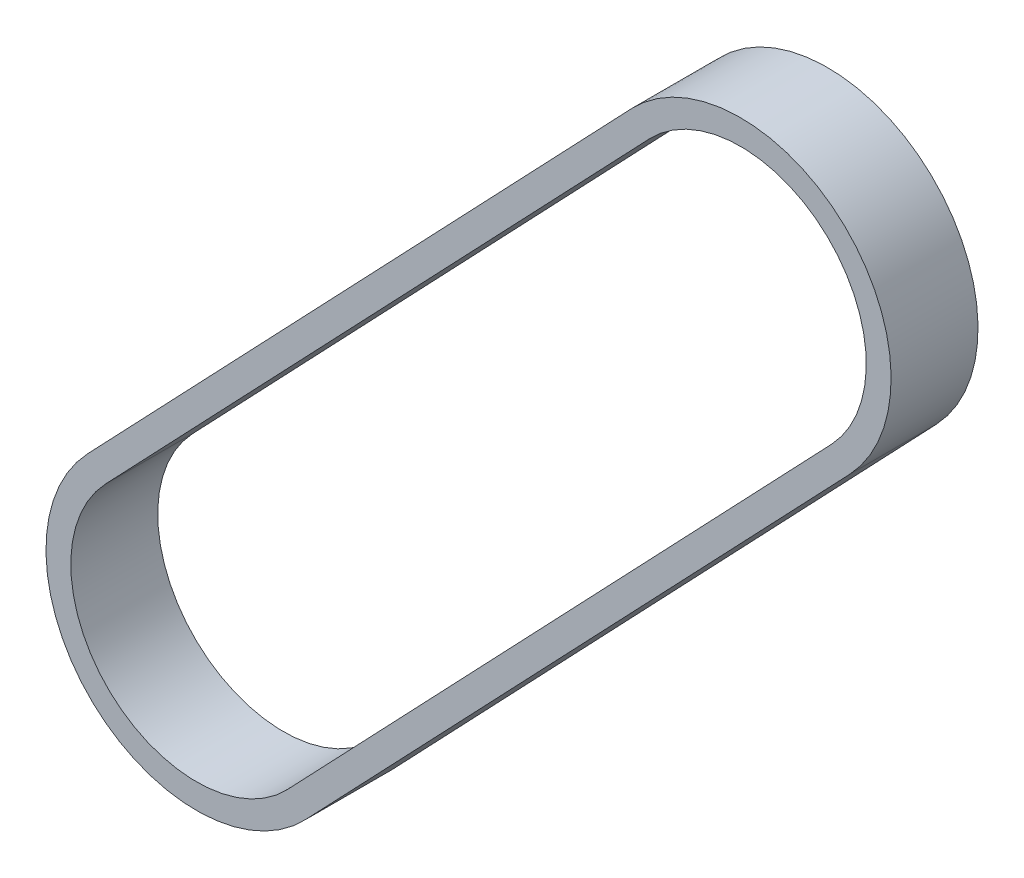
ISO-10303-21;
HEADER;
FILE_DESCRIPTION(('STEP AP214'),'2;1');
FILE_NAME('part.step','',(''),(''),'','','');
FILE_SCHEMA(('AUTOMOTIVE_DESIGN { 1 0 10303 214 1 1 1 1 }'));
ENDSEC;
DATA;
#1=APPLICATION_CONTEXT('core data for automotive mechanical design processes');
#2=APPLICATION_PROTOCOL_DEFINITION('international standard','automotive_design',2000,#1);
#3=PRODUCT_CONTEXT('',#1,'mechanical');
#4=PRODUCT('Part','Part','',(#3));
#5=PRODUCT_RELATED_PRODUCT_CATEGORY('part','',(#4));
#6=PRODUCT_DEFINITION_FORMATION('','',#4);
#7=PRODUCT_DEFINITION_CONTEXT('part definition',#1,'design');
#8=PRODUCT_DEFINITION('design','',#6,#7);
#9=PRODUCT_DEFINITION_SHAPE('','',#8);
#10=(LENGTH_UNIT() NAMED_UNIT(*) SI_UNIT(.MILLI.,.METRE.));
#11=(NAMED_UNIT(*) PLANE_ANGLE_UNIT() SI_UNIT($,.RADIAN.));
#12=(NAMED_UNIT(*) SI_UNIT($,.STERADIAN.) SOLID_ANGLE_UNIT());
#13=UNCERTAINTY_MEASURE_WITH_UNIT(LENGTH_MEASURE(1.E-05),#10,'distance_accuracy_value','');
#14=(GEOMETRIC_REPRESENTATION_CONTEXT(3) GLOBAL_UNCERTAINTY_ASSIGNED_CONTEXT((#13)) GLOBAL_UNIT_ASSIGNED_CONTEXT((#10,
#11,#12)) REPRESENTATION_CONTEXT('',''));
#15=CARTESIAN_POINT('',(0.,0.,0.));
#16=DIRECTION('',(0.,0.,1.));
#17=DIRECTION('',(1.,0.,0.));
#18=AXIS2_PLACEMENT_3D('',#15,#16,#17);
#19=CARTESIAN_POINT('',(9.99738339893753,-4.7045700668491E-12,7.));
#20=DIRECTION('',(0.,0.,-1.));
#21=DIRECTION('',(-1.,0.,0.));
#22=AXIS2_PLACEMENT_3D('',#19,#20,#21);
#23=PLANE('',#22);
#24=CARTESIAN_POINT('',(9.99738339893753,-4.7045700668491E-12,7.));
#25=DIRECTION('',(0.,0.,-1.));
#26=DIRECTION('',(-1.,0.,0.));
#27=AXIS2_PLACEMENT_3D('',#24,#25,#26);
#28=CIRCLE('',#27,12.125);
#29=CARTESIAN_POINT('',(18.7758071575492,-8.36390466913162,7.));
#30=VERTEX_POINT('',#29);
#31=CARTESIAN_POINT('',(1.21895964032592,8.36390466912223,7.));
#32=VERTEX_POINT('',#31);
#33=EDGE_CURVE('E160',#30,#32,#28,.F.);
#34=ORIENTED_EDGE('',*,*,#33,.T.);
#35=DIRECTION('',(-0.689806570649642,-0.723993712050443,0.));
#36=VECTOR('',#35,1.);
#37=CARTESIAN_POINT('',(1.21895964032591,8.36390466912221,7.));
#38=LINE('',#37,#36);
#39=CARTESIAN_POINT('',(-42.5837575959297,-37.6096960460844,7.));
#40=VERTEX_POINT('',#39);
#41=EDGE_CURVE('E163',#32,#40,#38,.T.);
#42=ORIENTED_EDGE('',*,*,#41,.T.);
#43=CARTESIAN_POINT('',(-33.805333837318,-45.9736007152113,7.));
#44=DIRECTION('',(0.,0.,-1.));
#45=DIRECTION('',(-1.,0.,0.));
#46=AXIS2_PLACEMENT_3D('',#43,#44,#45);
#47=CIRCLE('',#46,12.125);
#48=CARTESIAN_POINT('',(-25.0269100787064,-54.3375053843382,7.));
#49=VERTEX_POINT('',#48);
#50=EDGE_CURVE('E166',#40,#49,#47,.F.);
#51=ORIENTED_EDGE('',*,*,#50,.T.);
#52=DIRECTION('',(0.689806570649642,0.723993712050443,0.));
#53=VECTOR('',#52,1.);
#54=CARTESIAN_POINT('',(18.7758071575492,-8.36390466913162,7.));
#55=LINE('',#54,#53);
#56=EDGE_CURVE('E168',#49,#30,#55,.T.);
#57=ORIENTED_EDGE('',*,*,#56,.T.);
#58=EDGE_LOOP('',(#34,#42,#51,#57));
#59=FACE_BOUND('',#58,.T.);
#60=CARTESIAN_POINT('',(9.99738339893753,-4.7045700668491E-12,7.));
#61=DIRECTION('',(0.,0.,1.));
#62=DIRECTION('',(-1.,0.,0.));
#63=AXIS2_PLACEMENT_3D('',#60,#61,#62);
#64=CIRCLE('',#63,10.125);
#65=CARTESIAN_POINT('',(17.3278197334483,-6.98429152783234,7.));
#66=VERTEX_POINT('',#65);
#67=CARTESIAN_POINT('',(2.66694706442679,6.98429152782293,7.));
#68=VERTEX_POINT('',#67);
#69=EDGE_CURVE('E124',#66,#68,#64,.T.);
#70=ORIENTED_EDGE('',*,*,#69,.F.);
#71=DIRECTION('',(0.689806570649642,0.723993712050443,0.));
#72=VECTOR('',#71,1.);
#73=CARTESIAN_POINT('',(17.3278197334483,-6.98429152783234,7.));
#74=LINE('',#73,#72);
#75=CARTESIAN_POINT('',(-26.4748975028073,-52.9578922430389,7.));
#76=VERTEX_POINT('',#75);
#77=EDGE_CURVE('E146',#76,#66,#74,.T.);
#78=ORIENTED_EDGE('',*,*,#77,.F.);
#79=CARTESIAN_POINT('',(-33.805333837318,-45.9736007152113,7.));
#80=DIRECTION('',(0.,0.,1.));
#81=DIRECTION('',(-1.,0.,0.));
#82=AXIS2_PLACEMENT_3D('',#79,#80,#81);
#83=CIRCLE('',#82,10.125);
#84=CARTESIAN_POINT('',(-41.1357701718288,-38.9893091873836,7.));
#85=VERTEX_POINT('',#84);
#86=EDGE_CURVE('E144',#85,#76,#83,.T.);
#87=ORIENTED_EDGE('',*,*,#86,.F.);
#88=DIRECTION('',(-0.689806570649642,-0.723993712050443,0.));
#89=VECTOR('',#88,1.);
#90=CARTESIAN_POINT('',(-41.1357701718288,-38.9893091873836,7.));
#91=LINE('',#90,#89);
#92=EDGE_CURVE('E132',#68,#85,#91,.T.);
#93=ORIENTED_EDGE('',*,*,#92,.F.);
#94=EDGE_LOOP('',(#70,#78,#87,#93));
#95=FACE_BOUND('',#94,.T.);
#96=ADVANCED_FACE('F59',(#59,#95),#23,.F.);
#97=CARTESIAN_POINT('',(9.99738339893753,-4.7045700668491E-12,0.));
#98=DIRECTION('',(0.,0.,-1.));
#99=DIRECTION('',(-1.,0.,0.));
#100=AXIS2_PLACEMENT_3D('',#97,#98,#99);
#101=PLANE('',#100);
#102=CARTESIAN_POINT('',(9.99738339893753,-4.7045700668491E-12,0.));
#103=DIRECTION('',(0.,0.,-1.));
#104=DIRECTION('',(-1.,0.,0.));
#105=AXIS2_PLACEMENT_3D('',#102,#103,#104);
#106=CIRCLE('',#105,12.125);
#107=CARTESIAN_POINT('',(18.7758071575492,-8.36390466913162,0.));
#108=VERTEX_POINT('',#107);
#109=CARTESIAN_POINT('',(1.21895964032592,8.36390466912223,0.));
#110=VERTEX_POINT('',#109);
#111=EDGE_CURVE('E140',#108,#110,#106,.F.);
#112=ORIENTED_EDGE('',*,*,#111,.F.);
#113=DIRECTION('',(0.689806570649642,0.723993712050443,0.));
#114=VECTOR('',#113,1.);
#115=CARTESIAN_POINT('',(18.7758071575492,-8.36390466913162,0.));
#116=LINE('',#115,#114);
#117=CARTESIAN_POINT('',(-25.0269100787064,-54.3375053843382,0.));
#118=VERTEX_POINT('',#117);
#119=EDGE_CURVE('E164',#118,#108,#116,.T.);
#120=ORIENTED_EDGE('',*,*,#119,.F.);
#121=CARTESIAN_POINT('',(-33.805333837318,-45.9736007152113,0.));
#122=DIRECTION('',(0.,0.,-1.));
#123=DIRECTION('',(-1.,0.,0.));
#124=AXIS2_PLACEMENT_3D('',#121,#122,#123);
#125=CIRCLE('',#124,12.125);
#126=CARTESIAN_POINT('',(-42.5837575959297,-37.6096960460844,0.));
#127=VERTEX_POINT('',#126);
#128=EDGE_CURVE('E175',#127,#118,#125,.F.);
#129=ORIENTED_EDGE('',*,*,#128,.F.);
#130=DIRECTION('',(-0.689806570649642,-0.723993712050443,0.));
#131=VECTOR('',#130,1.);
#132=CARTESIAN_POINT('',(1.21895964032591,8.36390466912221,0.));
#133=LINE('',#132,#131);
#134=EDGE_CURVE('E173',#110,#127,#133,.T.);
#135=ORIENTED_EDGE('',*,*,#134,.F.);
#136=EDGE_LOOP('',(#112,#120,#129,#135));
#137=FACE_BOUND('',#136,.T.);
#138=DIRECTION('',(0.689806570649642,0.723993712050443,0.));
#139=VECTOR('',#138,1.);
#140=CARTESIAN_POINT('',(17.3278197334483,-6.98429152783234,0.));
#141=LINE('',#140,#139);
#142=CARTESIAN_POINT('',(-26.4748975028073,-52.9578922430389,0.));
#143=VERTEX_POINT('',#142);
#144=CARTESIAN_POINT('',(17.3278197334483,-6.98429152783234,0.));
#145=VERTEX_POINT('',#144);
#146=EDGE_CURVE('E133',#143,#145,#141,.T.);
#147=ORIENTED_EDGE('',*,*,#146,.T.);
#148=CARTESIAN_POINT('',(9.99738339893753,-4.7045700668491E-12,0.));
#149=DIRECTION('',(0.,0.,1.));
#150=DIRECTION('',(-1.,0.,0.));
#151=AXIS2_PLACEMENT_3D('',#148,#149,#150);
#152=CIRCLE('',#151,10.125);
#153=CARTESIAN_POINT('',(2.66694706442679,6.98429152782293,0.));
#154=VERTEX_POINT('',#153);
#155=EDGE_CURVE('E82',#145,#154,#152,.T.);
#156=ORIENTED_EDGE('',*,*,#155,.T.);
#157=DIRECTION('',(-0.689806570649642,-0.723993712050443,0.));
#158=VECTOR('',#157,1.);
#159=CARTESIAN_POINT('',(-41.1357701718288,-38.9893091873836,0.));
#160=LINE('',#159,#158);
#161=CARTESIAN_POINT('',(-41.1357701718288,-38.9893091873836,0.));
#162=VERTEX_POINT('',#161);
#163=EDGE_CURVE('E139',#154,#162,#160,.T.);
#164=ORIENTED_EDGE('',*,*,#163,.T.);
#165=CARTESIAN_POINT('',(-33.805333837318,-45.9736007152113,0.));
#166=DIRECTION('',(0.,0.,1.));
#167=DIRECTION('',(-1.,0.,0.));
#168=AXIS2_PLACEMENT_3D('',#165,#166,#167);
#169=CIRCLE('',#168,10.125);
#170=EDGE_CURVE('E152',#162,#143,#169,.T.);
#171=ORIENTED_EDGE('',*,*,#170,.T.);
#172=EDGE_LOOP('',(#147,#156,#164,#171));
#173=FACE_BOUND('',#172,.T.);
#174=ADVANCED_FACE('F193',(#137,#173),#101,.T.);
#175=CARTESIAN_POINT('',(9.99738339893753,-4.7045700668491E-12,7.));
#176=DIRECTION('',(0.,0.,-1.));
#177=DIRECTION('',(-1.,0.,0.));
#178=AXIS2_PLACEMENT_3D('',#175,#176,#177);
#179=CYLINDRICAL_SURFACE('',#178,12.125);
#180=ORIENTED_EDGE('',*,*,#111,.T.);
#181=DIRECTION('',(0.,0.,-1.));
#182=VECTOR('',#181,1.);
#183=CARTESIAN_POINT('',(1.21895964032592,8.36390466912223,7.));
#184=LINE('',#183,#182);
#185=EDGE_CURVE('E12',#32,#110,#184,.T.);
#186=ORIENTED_EDGE('',*,*,#185,.F.);
#187=ORIENTED_EDGE('',*,*,#33,.F.);
#188=DIRECTION('',(0.,0.,-1.));
#189=VECTOR('',#188,1.);
#190=CARTESIAN_POINT('',(18.7758071575492,-8.36390466913162,7.));
#191=LINE('',#190,#189);
#192=EDGE_CURVE('E170',#30,#108,#191,.T.);
#193=ORIENTED_EDGE('',*,*,#192,.T.);
#194=EDGE_LOOP('',(#180,#186,#187,#193));
#195=FACE_BOUND('',#194,.T.);
#196=ADVANCED_FACE('F61',(#195),#179,.T.);
#197=CARTESIAN_POINT('',(1.21895964032591,8.36390466912221,7.));
#198=DIRECTION('',(0.723993712050443,-0.689806570649642,0.));
#199=DIRECTION('',(0.689806570649642,0.723993712050443,0.));
#200=AXIS2_PLACEMENT_3D('',#197,#198,#199);
#201=PLANE('',#200);
#202=ORIENTED_EDGE('',*,*,#134,.T.);
#203=DIRECTION('',(0.,0.,-1.));
#204=VECTOR('',#203,1.);
#205=CARTESIAN_POINT('',(-42.5837575959297,-37.6096960460844,7.));
#206=LINE('',#205,#204);
#207=EDGE_CURVE('E67',#40,#127,#206,.T.);
#208=ORIENTED_EDGE('',*,*,#207,.F.);
#209=ORIENTED_EDGE('',*,*,#41,.F.);
#210=ORIENTED_EDGE('',*,*,#185,.T.);
#211=EDGE_LOOP('',(#202,#208,#209,#210));
#212=FACE_BOUND('',#211,.T.);
#213=ADVANCED_FACE('F203',(#212),#201,.F.);
#214=CARTESIAN_POINT('',(-33.805333837318,-45.9736007152113,7.));
#215=DIRECTION('',(0.,0.,-1.));
#216=DIRECTION('',(-1.,0.,0.));
#217=AXIS2_PLACEMENT_3D('',#214,#215,#216);
#218=CYLINDRICAL_SURFACE('',#217,12.125);
#219=ORIENTED_EDGE('',*,*,#128,.T.);
#220=DIRECTION('',(0.,0.,-1.));
#221=VECTOR('',#220,1.);
#222=CARTESIAN_POINT('',(-25.0269100787064,-54.3375053843382,7.));
#223=LINE('',#222,#221);
#224=EDGE_CURVE('E180',#49,#118,#223,.T.);
#225=ORIENTED_EDGE('',*,*,#224,.F.);
#226=ORIENTED_EDGE('',*,*,#50,.F.);
#227=ORIENTED_EDGE('',*,*,#207,.T.);
#228=EDGE_LOOP('',(#219,#225,#226,#227));
#229=FACE_BOUND('',#228,.T.);
#230=ADVANCED_FACE('F187',(#229),#218,.T.);
#231=CARTESIAN_POINT('',(18.7758071575492,-8.36390466913162,7.));
#232=DIRECTION('',(-0.723993712050443,0.689806570649642,0.));
#233=DIRECTION('',(-0.689806570649642,-0.723993712050443,0.));
#234=AXIS2_PLACEMENT_3D('',#231,#232,#233);
#235=PLANE('',#234);
#236=ORIENTED_EDGE('',*,*,#119,.T.);
#237=ORIENTED_EDGE('',*,*,#192,.F.);
#238=ORIENTED_EDGE('',*,*,#56,.F.);
#239=ORIENTED_EDGE('',*,*,#224,.T.);
#240=EDGE_LOOP('',(#236,#237,#238,#239));
#241=FACE_BOUND('',#240,.T.);
#242=ADVANCED_FACE('F197',(#241),#235,.F.);
#243=CARTESIAN_POINT('',(9.99738339893753,-4.7045700668491E-12,7.));
#244=DIRECTION('',(0.,0.,-1.));
#245=DIRECTION('',(-1.,0.,0.));
#246=AXIS2_PLACEMENT_3D('',#243,#244,#245);
#247=CYLINDRICAL_SURFACE('',#246,10.125);
#248=ORIENTED_EDGE('',*,*,#155,.F.);
#249=DIRECTION('',(0.,0.,-1.));
#250=VECTOR('',#249,1.);
#251=CARTESIAN_POINT('',(17.3278197334483,-6.98429152783234,7.));
#252=LINE('',#251,#250);
#253=EDGE_CURVE('E128',#66,#145,#252,.T.);
#254=ORIENTED_EDGE('',*,*,#253,.F.);
#255=ORIENTED_EDGE('',*,*,#69,.T.);
#256=DIRECTION('',(0.,0.,-1.));
#257=VECTOR('',#256,1.);
#258=CARTESIAN_POINT('',(2.66694706442679,6.98429152782293,7.));
#259=LINE('',#258,#257);
#260=EDGE_CURVE('E127',#68,#154,#259,.T.);
#261=ORIENTED_EDGE('',*,*,#260,.T.);
#262=EDGE_LOOP('',(#248,#254,#255,#261));
#263=FACE_BOUND('',#262,.T.);
#264=ADVANCED_FACE('F126',(#263),#247,.F.);
#265=CARTESIAN_POINT('',(-41.1357701718288,-38.9893091873836,7.));
#266=DIRECTION('',(0.723993712050443,-0.689806570649642,0.));
#267=DIRECTION('',(0.689806570649642,0.723993712050443,0.));
#268=AXIS2_PLACEMENT_3D('',#265,#266,#267);
#269=PLANE('',#268);
#270=ORIENTED_EDGE('',*,*,#163,.F.);
#271=ORIENTED_EDGE('',*,*,#260,.F.);
#272=ORIENTED_EDGE('',*,*,#92,.T.);
#273=DIRECTION('',(0.,0.,-1.));
#274=VECTOR('',#273,1.);
#275=CARTESIAN_POINT('',(-41.1357701718288,-38.9893091873836,7.));
#276=LINE('',#275,#274);
#277=EDGE_CURVE('E141',#85,#162,#276,.T.);
#278=ORIENTED_EDGE('',*,*,#277,.T.);
#279=EDGE_LOOP('',(#270,#271,#272,#278));
#280=FACE_BOUND('',#279,.T.);
#281=ADVANCED_FACE('F136',(#280),#269,.T.);
#282=CARTESIAN_POINT('',(-33.805333837318,-45.9736007152113,7.));
#283=DIRECTION('',(0.,0.,-1.));
#284=DIRECTION('',(-1.,0.,0.));
#285=AXIS2_PLACEMENT_3D('',#282,#283,#284);
#286=CYLINDRICAL_SURFACE('',#285,10.125);
#287=ORIENTED_EDGE('',*,*,#170,.F.);
#288=ORIENTED_EDGE('',*,*,#277,.F.);
#289=ORIENTED_EDGE('',*,*,#86,.T.);
#290=DIRECTION('',(0.,0.,-1.));
#291=VECTOR('',#290,1.);
#292=CARTESIAN_POINT('',(-26.4748975028073,-52.9578922430389,7.));
#293=LINE('',#292,#291);
#294=EDGE_CURVE('E74',#76,#143,#293,.T.);
#295=ORIENTED_EDGE('',*,*,#294,.T.);
#296=EDGE_LOOP('',(#287,#288,#289,#295));
#297=FACE_BOUND('',#296,.T.);
#298=ADVANCED_FACE('F226',(#297),#286,.F.);
#299=CARTESIAN_POINT('',(17.3278197334483,-6.98429152783234,7.));
#300=DIRECTION('',(-0.723993712050443,0.689806570649642,0.));
#301=DIRECTION('',(-0.689806570649642,-0.723993712050443,0.));
#302=AXIS2_PLACEMENT_3D('',#299,#300,#301);
#303=PLANE('',#302);
#304=ORIENTED_EDGE('',*,*,#146,.F.);
#305=ORIENTED_EDGE('',*,*,#294,.F.);
#306=ORIENTED_EDGE('',*,*,#77,.T.);
#307=ORIENTED_EDGE('',*,*,#253,.T.);
#308=EDGE_LOOP('',(#304,#305,#306,#307));
#309=FACE_BOUND('',#308,.T.);
#310=ADVANCED_FACE('F230',(#309),#303,.T.);
#311=CLOSED_SHELL('',(#96,#174,#196,#213,#230,#242,#264,#281,#298,#310));
#312=MANIFOLD_SOLID_BREP('B2',#311);
#313=ADVANCED_BREP_SHAPE_REPRESENTATION('',(#18,#312),#14);
#314=SHAPE_DEFINITION_REPRESENTATION(#9,#313);
ENDSEC;
END-ISO-10303-21;
